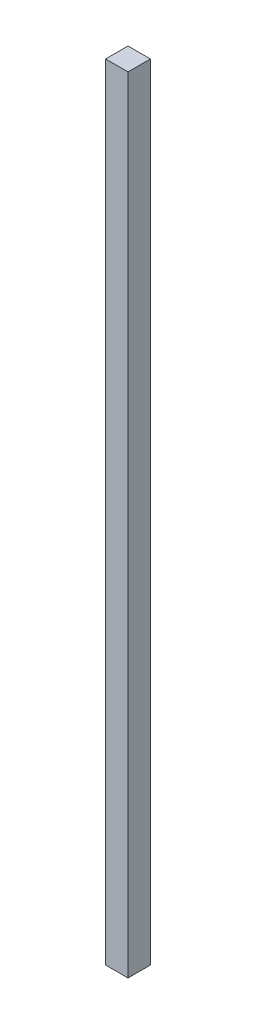
ISO-10303-21;
HEADER;
FILE_DESCRIPTION(('STEP AP214'),'2;1');
FILE_NAME('part.step','',(''),(''),'','','');
FILE_SCHEMA(('AUTOMOTIVE_DESIGN { 1 0 10303 214 1 1 1 1 }'));
ENDSEC;
DATA;
#1=APPLICATION_CONTEXT('core data for automotive mechanical design processes');
#2=APPLICATION_PROTOCOL_DEFINITION('international standard','automotive_design',2000,#1);
#3=PRODUCT_CONTEXT('',#1,'mechanical');
#4=PRODUCT('Part','Part','',(#3));
#5=PRODUCT_RELATED_PRODUCT_CATEGORY('part','',(#4));
#6=PRODUCT_DEFINITION_FORMATION('','',#4);
#7=PRODUCT_DEFINITION_CONTEXT('part definition',#1,'design');
#8=PRODUCT_DEFINITION('design','',#6,#7);
#9=PRODUCT_DEFINITION_SHAPE('','',#8);
#10=(LENGTH_UNIT() NAMED_UNIT(*) SI_UNIT(.MILLI.,.METRE.));
#11=(NAMED_UNIT(*) PLANE_ANGLE_UNIT() SI_UNIT($,.RADIAN.));
#12=(NAMED_UNIT(*) SI_UNIT($,.STERADIAN.) SOLID_ANGLE_UNIT());
#13=UNCERTAINTY_MEASURE_WITH_UNIT(LENGTH_MEASURE(1.E-05),#10,'distance_accuracy_value','');
#14=(GEOMETRIC_REPRESENTATION_CONTEXT(3) GLOBAL_UNCERTAINTY_ASSIGNED_CONTEXT((#13)) GLOBAL_UNIT_ASSIGNED_CONTEXT((#10,
#11,#12)) REPRESENTATION_CONTEXT('',''));
#15=CARTESIAN_POINT('',(0.,0.,0.));
#16=DIRECTION('',(0.,0.,1.));
#17=DIRECTION('',(1.,0.,0.));
#18=AXIS2_PLACEMENT_3D('',#15,#16,#17);
#19=CARTESIAN_POINT('',(10.,700.,-10.));
#20=DIRECTION('',(-1.,0.,0.));
#21=DIRECTION('',(0.,0.,1.));
#22=AXIS2_PLACEMENT_3D('',#19,#20,#21);
#23=PLANE('',#22);
#24=DIRECTION('',(0.,0.,-1.));
#25=VECTOR('',#24,1.);
#26=CARTESIAN_POINT('',(10.,0.,-10.));
#27=LINE('',#26,#25);
#28=CARTESIAN_POINT('',(10.,0.,10.));
#29=VERTEX_POINT('',#28);
#30=CARTESIAN_POINT('',(10.,0.,-10.));
#31=VERTEX_POINT('',#30);
#32=EDGE_CURVE('E107',#29,#31,#27,.T.);
#33=ORIENTED_EDGE('',*,*,#32,.T.);
#34=DIRECTION('',(0.,-1.,0.));
#35=VECTOR('',#34,1.);
#36=CARTESIAN_POINT('',(10.,700.,-10.));
#37=LINE('',#36,#35);
#38=CARTESIAN_POINT('',(10.,700.,-10.));
#39=VERTEX_POINT('',#38);
#40=EDGE_CURVE('E11',#39,#31,#37,.T.);
#41=ORIENTED_EDGE('',*,*,#40,.F.);
#42=DIRECTION('',(0.,0.,-1.));
#43=VECTOR('',#42,1.);
#44=CARTESIAN_POINT('',(10.,700.,-10.));
#45=LINE('',#44,#43);
#46=CARTESIAN_POINT('',(10.,700.,10.));
#47=VERTEX_POINT('',#46);
#48=EDGE_CURVE('E91',#47,#39,#45,.T.);
#49=ORIENTED_EDGE('',*,*,#48,.F.);
#50=DIRECTION('',(0.,-1.,0.));
#51=VECTOR('',#50,1.);
#52=CARTESIAN_POINT('',(10.,700.,10.));
#53=LINE('',#52,#51);
#54=EDGE_CURVE('E103',#47,#29,#53,.T.);
#55=ORIENTED_EDGE('',*,*,#54,.T.);
#56=EDGE_LOOP('',(#33,#41,#49,#55));
#57=FACE_BOUND('',#56,.T.);
#58=ADVANCED_FACE('F39',(#57),#23,.F.);
#59=CARTESIAN_POINT('',(-10.,700.,-10.));
#60=DIRECTION('',(0.,0.,1.));
#61=DIRECTION('',(1.,0.,0.));
#62=AXIS2_PLACEMENT_3D('',#59,#60,#61);
#63=PLANE('',#62);
#64=DIRECTION('',(-1.,0.,0.));
#65=VECTOR('',#64,1.);
#66=CARTESIAN_POINT('',(-10.,0.,-10.));
#67=LINE('',#66,#65);
#68=CARTESIAN_POINT('',(-10.,0.,-10.));
#69=VERTEX_POINT('',#68);
#70=EDGE_CURVE('E96',#31,#69,#67,.T.);
#71=ORIENTED_EDGE('',*,*,#70,.T.);
#72=DIRECTION('',(0.,-1.,0.));
#73=VECTOR('',#72,1.);
#74=CARTESIAN_POINT('',(-10.,700.,-10.));
#75=LINE('',#74,#73);
#76=CARTESIAN_POINT('',(-10.,700.,-10.));
#77=VERTEX_POINT('',#76);
#78=EDGE_CURVE('E48',#77,#69,#75,.T.);
#79=ORIENTED_EDGE('',*,*,#78,.F.);
#80=DIRECTION('',(-1.,0.,0.));
#81=VECTOR('',#80,1.);
#82=CARTESIAN_POINT('',(-10.,700.,-10.));
#83=LINE('',#82,#81);
#84=EDGE_CURVE('E86',#39,#77,#83,.T.);
#85=ORIENTED_EDGE('',*,*,#84,.F.);
#86=ORIENTED_EDGE('',*,*,#40,.T.);
#87=EDGE_LOOP('',(#71,#79,#85,#86));
#88=FACE_BOUND('',#87,.T.);
#89=ADVANCED_FACE('F95',(#88),#63,.F.);
#90=CARTESIAN_POINT('',(-10.,700.,-10.));
#91=DIRECTION('',(1.,0.,0.));
#92=DIRECTION('',(0.,0.,-1.));
#93=AXIS2_PLACEMENT_3D('',#90,#91,#92);
#94=PLANE('',#93);
#95=DIRECTION('',(0.,0.,1.));
#96=VECTOR('',#95,1.);
#97=CARTESIAN_POINT('',(-10.,0.,-10.));
#98=LINE('',#97,#96);
#99=CARTESIAN_POINT('',(-10.,0.,10.));
#100=VERTEX_POINT('',#99);
#101=EDGE_CURVE('E73',#69,#100,#98,.T.);
#102=ORIENTED_EDGE('',*,*,#101,.T.);
#103=DIRECTION('',(0.,-1.,0.));
#104=VECTOR('',#103,1.);
#105=CARTESIAN_POINT('',(-10.,700.,10.));
#106=LINE('',#105,#104);
#107=CARTESIAN_POINT('',(-10.,700.,10.));
#108=VERTEX_POINT('',#107);
#109=EDGE_CURVE('E98',#108,#100,#106,.T.);
#110=ORIENTED_EDGE('',*,*,#109,.F.);
#111=DIRECTION('',(0.,0.,1.));
#112=VECTOR('',#111,1.);
#113=CARTESIAN_POINT('',(-10.,700.,-10.));
#114=LINE('',#113,#112);
#115=EDGE_CURVE('E89',#77,#108,#114,.T.);
#116=ORIENTED_EDGE('',*,*,#115,.F.);
#117=ORIENTED_EDGE('',*,*,#78,.T.);
#118=EDGE_LOOP('',(#102,#110,#116,#117));
#119=FACE_BOUND('',#118,.T.);
#120=ADVANCED_FACE('F99',(#119),#94,.F.);
#121=CARTESIAN_POINT('',(-10.,700.,10.));
#122=DIRECTION('',(0.,0.,-1.));
#123=DIRECTION('',(-1.,0.,0.));
#124=AXIS2_PLACEMENT_3D('',#121,#122,#123);
#125=PLANE('',#124);
#126=DIRECTION('',(1.,0.,0.));
#127=VECTOR('',#126,1.);
#128=CARTESIAN_POINT('',(-10.,0.,10.));
#129=LINE('',#128,#127);
#130=EDGE_CURVE('E79',#100,#29,#129,.T.);
#131=ORIENTED_EDGE('',*,*,#130,.T.);
#132=ORIENTED_EDGE('',*,*,#54,.F.);
#133=DIRECTION('',(1.,0.,0.));
#134=VECTOR('',#133,1.);
#135=CARTESIAN_POINT('',(-10.,700.,10.));
#136=LINE('',#135,#134);
#137=EDGE_CURVE('E56',#108,#47,#136,.T.);
#138=ORIENTED_EDGE('',*,*,#137,.F.);
#139=ORIENTED_EDGE('',*,*,#109,.T.);
#140=EDGE_LOOP('',(#131,#132,#138,#139));
#141=FACE_BOUND('',#140,.T.);
#142=ADVANCED_FACE('F120',(#141),#125,.F.);
#143=CARTESIAN_POINT('',(0.,700.,0.));
#144=DIRECTION('',(0.,1.,0.));
#145=DIRECTION('',(0.,0.,1.));
#146=AXIS2_PLACEMENT_3D('',#143,#144,#145);
#147=PLANE('',#146);
#148=ORIENTED_EDGE('',*,*,#48,.T.);
#149=ORIENTED_EDGE('',*,*,#84,.T.);
#150=ORIENTED_EDGE('',*,*,#115,.T.);
#151=ORIENTED_EDGE('',*,*,#137,.T.);
#152=EDGE_LOOP('',(#148,#149,#150,#151));
#153=FACE_BOUND('',#152,.T.);
#154=ADVANCED_FACE('F87',(#153),#147,.T.);
#155=CARTESIAN_POINT('',(0.,0.,0.));
#156=DIRECTION('',(0.,1.,0.));
#157=DIRECTION('',(0.,0.,1.));
#158=AXIS2_PLACEMENT_3D('',#155,#156,#157);
#159=PLANE('',#158);
#160=ORIENTED_EDGE('',*,*,#32,.F.);
#161=ORIENTED_EDGE('',*,*,#130,.F.);
#162=ORIENTED_EDGE('',*,*,#101,.F.);
#163=ORIENTED_EDGE('',*,*,#70,.F.);
#164=EDGE_LOOP('',(#160,#161,#162,#163));
#165=FACE_BOUND('',#164,.T.);
#166=ADVANCED_FACE('F123',(#165),#159,.F.);
#167=CLOSED_SHELL('',(#58,#89,#120,#142,#154,#166));
#168=MANIFOLD_SOLID_BREP('B2',#167);
#169=ADVANCED_BREP_SHAPE_REPRESENTATION('',(#18,#168),#14);
#170=SHAPE_DEFINITION_REPRESENTATION(#9,#169);
ENDSEC;
END-ISO-10303-21;
